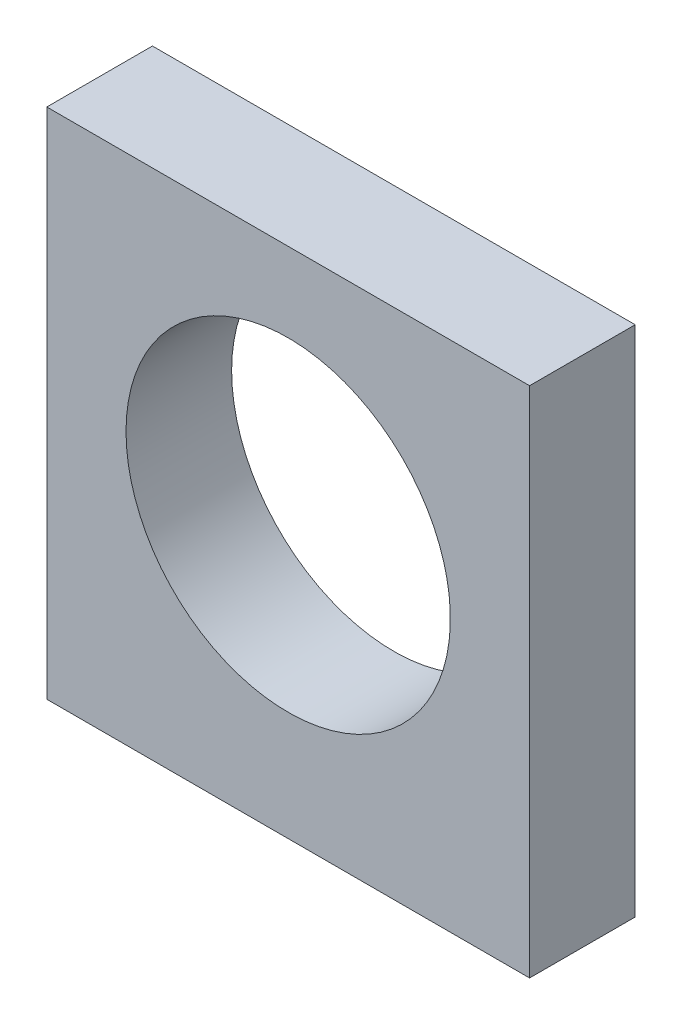
ISO-10303-21;
HEADER;
FILE_DESCRIPTION(('STEP AP214'),'2;1');
FILE_NAME('part.step','',(''),(''),'','','');
FILE_SCHEMA(('AUTOMOTIVE_DESIGN { 1 0 10303 214 1 1 1 1 }'));
ENDSEC;
DATA;
#1=APPLICATION_CONTEXT('core data for automotive mechanical design processes');
#2=APPLICATION_PROTOCOL_DEFINITION('international standard','automotive_design',2000,#1);
#3=PRODUCT_CONTEXT('',#1,'mechanical');
#4=PRODUCT('Part','Part','',(#3));
#5=PRODUCT_RELATED_PRODUCT_CATEGORY('part','',(#4));
#6=PRODUCT_DEFINITION_FORMATION('','',#4);
#7=PRODUCT_DEFINITION_CONTEXT('part definition',#1,'design');
#8=PRODUCT_DEFINITION('design','',#6,#7);
#9=PRODUCT_DEFINITION_SHAPE('','',#8);
#10=(LENGTH_UNIT() NAMED_UNIT(*) SI_UNIT(.MILLI.,.METRE.));
#11=(NAMED_UNIT(*) PLANE_ANGLE_UNIT() SI_UNIT($,.RADIAN.));
#12=(NAMED_UNIT(*) SI_UNIT($,.STERADIAN.) SOLID_ANGLE_UNIT());
#13=UNCERTAINTY_MEASURE_WITH_UNIT(LENGTH_MEASURE(1.E-05),#10,'distance_accuracy_value','');
#14=(GEOMETRIC_REPRESENTATION_CONTEXT(3) GLOBAL_UNCERTAINTY_ASSIGNED_CONTEXT((#13)) GLOBAL_UNIT_ASSIGNED_CONTEXT((#10,
#11,#12)) REPRESENTATION_CONTEXT('',''));
#15=CARTESIAN_POINT('',(0.,0.,0.));
#16=DIRECTION('',(0.,0.,1.));
#17=DIRECTION('',(1.,0.,0.));
#18=AXIS2_PLACEMENT_3D('',#15,#16,#17);
#19=CARTESIAN_POINT('',(-30.2679908457876,-2.71237973809173,8.6839378711212));
#20=DIRECTION('',(0.,1.,0.));
#21=DIRECTION('',(0.,0.,1.));
#22=AXIS2_PLACEMENT_3D('',#19,#20,#21);
#23=PLANE('',#22);
#24=CARTESIAN_POINT('',(-30.2679908457876,-2.71237973809173,8.6839378711212));
#25=DIRECTION('',(0.,1.,0.));
#26=DIRECTION('',(0.,0.,1.));
#27=AXIS2_PLACEMENT_3D('',#24,#25,#26);
#28=CIRCLE('',#27,1.5);
#29=CARTESIAN_POINT('',(-30.2679908457876,-2.71237973809173,10.1839378711212));
#30=VERTEX_POINT('',#29);
#31=EDGE_CURVE('E20',#30,#30,#28,.F.);
#32=ORIENTED_EDGE('',*,*,#31,.T.);
#33=EDGE_LOOP('',(#32));
#34=FACE_BOUND('',#33,.T.);
#35=ADVANCED_FACE('F17',(#34),#23,.F.);
#36=CARTESIAN_POINT('',(-13.2679908457876,-2.71237973809173,8.68393787112121));
#37=DIRECTION('',(0.,1.,0.));
#38=DIRECTION('',(0.,0.,1.));
#39=AXIS2_PLACEMENT_3D('',#36,#37,#38);
#40=PLANE('',#39);
#41=CARTESIAN_POINT('',(-13.2679908457876,-2.71237973809173,8.68393787112121));
#42=DIRECTION('',(0.,1.,0.));
#43=DIRECTION('',(0.,0.,1.));
#44=AXIS2_PLACEMENT_3D('',#41,#42,#43);
#45=CIRCLE('',#44,1.5);
#46=CARTESIAN_POINT('',(-13.2679908457876,-2.71237973809172,10.1839378711212));
#47=VERTEX_POINT('',#46);
#48=EDGE_CURVE('E108',#47,#47,#45,.F.);
#49=ORIENTED_EDGE('',*,*,#48,.T.);
#50=EDGE_LOOP('',(#49));
#51=FACE_BOUND('',#50,.T.);
#52=ADVANCED_FACE('F174',(#51),#40,.F.);
#53=CARTESIAN_POINT('',(-27.7679908457876,-2.71237973809173,10.7839378711212));
#54=DIRECTION('',(0.,1.,0.));
#55=DIRECTION('',(0.,0.,1.));
#56=AXIS2_PLACEMENT_3D('',#53,#54,#55);
#57=PLANE('',#56);
#58=CARTESIAN_POINT('',(-27.7679908457876,-2.71237973809173,10.7839378711212));
#59=DIRECTION('',(0.,1.,0.));
#60=DIRECTION('',(0.,0.,1.));
#61=AXIS2_PLACEMENT_3D('',#58,#59,#60);
#62=CIRCLE('',#61,1.);
#63=CARTESIAN_POINT('',(-27.7679908457876,-2.71237973809173,11.7839378711212));
#64=VERTEX_POINT('',#63);
#65=EDGE_CURVE('E106',#64,#64,#62,.F.);
#66=ORIENTED_EDGE('',*,*,#65,.T.);
#67=EDGE_LOOP('',(#66));
#68=FACE_BOUND('',#67,.T.);
#69=ADVANCED_FACE('F171',(#68),#57,.F.);
#70=CARTESIAN_POINT('',(-15.7679908457876,-2.71237973809172,10.7839378711212));
#71=DIRECTION('',(0.,1.,0.));
#72=DIRECTION('',(0.,0.,1.));
#73=AXIS2_PLACEMENT_3D('',#70,#71,#72);
#74=PLANE('',#73);
#75=CARTESIAN_POINT('',(-15.7679908457876,-2.71237973809173,10.7839378711212));
#76=DIRECTION('',(0.,1.,0.));
#77=DIRECTION('',(0.,0.,1.));
#78=AXIS2_PLACEMENT_3D('',#75,#76,#77);
#79=CIRCLE('',#78,1.);
#80=CARTESIAN_POINT('',(-15.7679908457876,-2.71237973809172,11.7839378711212));
#81=VERTEX_POINT('',#80);
#82=EDGE_CURVE('E103',#81,#81,#79,.F.);
#83=ORIENTED_EDGE('',*,*,#82,.T.);
#84=EDGE_LOOP('',(#83));
#85=FACE_BOUND('',#84,.T.);
#86=ADVANCED_FACE('F120',(#85),#74,.F.);
#87=CARTESIAN_POINT('',(-30.2679908457876,-6.71237973809173,8.68393787112121));
#88=DIRECTION('',(0.,1.,0.));
#89=DIRECTION('',(0.,0.,1.));
#90=AXIS2_PLACEMENT_3D('',#87,#88,#89);
#91=CYLINDRICAL_SURFACE('',#90,1.5);
#92=ORIENTED_EDGE('',*,*,#31,.F.);
#93=EDGE_LOOP('',(#92));
#94=FACE_BOUND('',#93,.T.);
#95=CARTESIAN_POINT('',(-30.2679908457876,-6.71237973809172,8.68393787112121));
#96=DIRECTION('',(0.,1.,0.));
#97=DIRECTION('',(0.,0.,1.));
#98=AXIS2_PLACEMENT_3D('',#95,#96,#97);
#99=CIRCLE('',#98,1.5);
#100=CARTESIAN_POINT('',(-30.2679908457876,-6.71237973809172,10.1839378711212));
#101=VERTEX_POINT('',#100);
#102=EDGE_CURVE('E69',#101,#101,#99,.T.);
#103=ORIENTED_EDGE('',*,*,#102,.F.);
#104=EDGE_LOOP('',(#103));
#105=FACE_BOUND('',#104,.T.);
#106=ADVANCED_FACE('F116',(#94,#105),#91,.F.);
#107=CARTESIAN_POINT('',(-13.2679908457876,-6.71237973809173,8.68393787112121));
#108=DIRECTION('',(0.,1.,0.));
#109=DIRECTION('',(0.,0.,1.));
#110=AXIS2_PLACEMENT_3D('',#107,#108,#109);
#111=CYLINDRICAL_SURFACE('',#110,1.5);
#112=ORIENTED_EDGE('',*,*,#48,.F.);
#113=EDGE_LOOP('',(#112));
#114=FACE_BOUND('',#113,.T.);
#115=CARTESIAN_POINT('',(-13.2679908457876,-6.71237973809172,8.68393787112121));
#116=DIRECTION('',(0.,1.,0.));
#117=DIRECTION('',(0.,0.,1.));
#118=AXIS2_PLACEMENT_3D('',#115,#116,#117);
#119=CIRCLE('',#118,1.5);
#120=CARTESIAN_POINT('',(-13.2679908457876,-6.71237973809172,10.1839378711212));
#121=VERTEX_POINT('',#120);
#122=EDGE_CURVE('E96',#121,#121,#119,.T.);
#123=ORIENTED_EDGE('',*,*,#122,.F.);
#124=EDGE_LOOP('',(#123));
#125=FACE_BOUND('',#124,.T.);
#126=ADVANCED_FACE('F119',(#114,#125),#111,.F.);
#127=CARTESIAN_POINT('',(-27.7679908457876,-6.71237973809173,10.7839378711212));
#128=DIRECTION('',(0.,1.,0.));
#129=DIRECTION('',(0.,0.,1.));
#130=AXIS2_PLACEMENT_3D('',#127,#128,#129);
#131=CYLINDRICAL_SURFACE('',#130,1.);
#132=ORIENTED_EDGE('',*,*,#65,.F.);
#133=EDGE_LOOP('',(#132));
#134=FACE_BOUND('',#133,.T.);
#135=CARTESIAN_POINT('',(-27.7679908457876,-6.71237973809172,10.7839378711212));
#136=DIRECTION('',(0.,1.,0.));
#137=DIRECTION('',(0.,0.,1.));
#138=AXIS2_PLACEMENT_3D('',#135,#136,#137);
#139=CIRCLE('',#138,1.);
#140=CARTESIAN_POINT('',(-27.7679908457876,-6.71237973809172,11.7839378711212));
#141=VERTEX_POINT('',#140);
#142=EDGE_CURVE('E86',#141,#141,#139,.T.);
#143=ORIENTED_EDGE('',*,*,#142,.F.);
#144=EDGE_LOOP('',(#143));
#145=FACE_BOUND('',#144,.T.);
#146=ADVANCED_FACE('F161',(#134,#145),#131,.F.);
#147=CARTESIAN_POINT('',(-15.7679908457876,-6.71237973809172,10.7839378711212));
#148=DIRECTION('',(0.,1.,0.));
#149=DIRECTION('',(0.,0.,1.));
#150=AXIS2_PLACEMENT_3D('',#147,#148,#149);
#151=CYLINDRICAL_SURFACE('',#150,1.);
#152=ORIENTED_EDGE('',*,*,#82,.F.);
#153=EDGE_LOOP('',(#152));
#154=FACE_BOUND('',#153,.T.);
#155=CARTESIAN_POINT('',(-15.7679908457876,-6.71237973809172,10.7839378711212));
#156=DIRECTION('',(0.,1.,0.));
#157=DIRECTION('',(0.,0.,1.));
#158=AXIS2_PLACEMENT_3D('',#155,#156,#157);
#159=CIRCLE('',#158,1.);
#160=CARTESIAN_POINT('',(-15.7679908457876,-6.71237973809172,11.7839378711212));
#161=VERTEX_POINT('',#160);
#162=EDGE_CURVE('E83',#161,#161,#159,.T.);
#163=ORIENTED_EDGE('',*,*,#162,.F.);
#164=EDGE_LOOP('',(#163));
#165=FACE_BOUND('',#164,.T.);
#166=ADVANCED_FACE('F155',(#154,#165),#151,.F.);
#167=CARTESIAN_POINT('',(-21.7679908457876,10.2876202619083,13.2839378711212));
#168=DIRECTION('',(0.,0.,-1.));
#169=DIRECTION('',(-1.,0.,0.));
#170=AXIS2_PLACEMENT_3D('',#167,#168,#169);
#171=PLANE('',#170);
#172=DIRECTION('',(0.,1.,0.));
#173=VECTOR('',#172,1.);
#174=CARTESIAN_POINT('',(-5.76799084578759,-6.71237973809171,13.2839378711212));
#175=LINE('',#174,#173);
#176=CARTESIAN_POINT('',(-5.76799084578761,27.2876202619083,13.2839378711212));
#177=VERTEX_POINT('',#176);
#178=CARTESIAN_POINT('',(-5.76799084578759,-6.71237973809171,13.2839378711212));
#179=VERTEX_POINT('',#178);
#180=EDGE_CURVE('E60',#177,#179,#175,.F.);
#181=ORIENTED_EDGE('',*,*,#180,.F.);
#182=DIRECTION('',(1.,0.,0.));
#183=VECTOR('',#182,1.);
#184=CARTESIAN_POINT('',(-5.76799084578761,27.2876202619083,13.2839378711212));
#185=LINE('',#184,#183);
#186=CARTESIAN_POINT('',(-37.7679908457876,27.2876202619083,13.2839378711212));
#187=VERTEX_POINT('',#186);
#188=EDGE_CURVE('E284',#187,#177,#185,.T.);
#189=ORIENTED_EDGE('',*,*,#188,.F.);
#190=DIRECTION('',(0.,1.,0.));
#191=VECTOR('',#190,1.);
#192=CARTESIAN_POINT('',(-37.7679908457876,27.2876202619083,13.2839378711212));
#193=LINE('',#192,#191);
#194=CARTESIAN_POINT('',(-37.7679908457876,-6.71237973809172,13.2839378711212));
#195=VERTEX_POINT('',#194);
#196=EDGE_CURVE('E74',#195,#187,#193,.T.);
#197=ORIENTED_EDGE('',*,*,#196,.F.);
#198=DIRECTION('',(1.,0.,0.));
#199=VECTOR('',#198,1.);
#200=CARTESIAN_POINT('',(-37.7679908457876,-6.71237973809172,13.2839378711212));
#201=LINE('',#200,#199);
#202=EDGE_CURVE('E55',#179,#195,#201,.F.);
#203=ORIENTED_EDGE('',*,*,#202,.F.);
#204=EDGE_LOOP('',(#181,#189,#197,#203));
#205=FACE_BOUND('',#204,.T.);
#206=CARTESIAN_POINT('',(-21.7679908457876,11.2876202619083,13.2839378711212));
#207=DIRECTION('',(0.,0.,-1.));
#208=DIRECTION('',(-1.,0.,0.));
#209=AXIS2_PLACEMENT_3D('',#206,#207,#208);
#210=CIRCLE('',#209,10.75);
#211=CARTESIAN_POINT('',(-32.5179908457876,11.2876202619083,13.2839378711212));
#212=VERTEX_POINT('',#211);
#213=EDGE_CURVE('E70',#212,#212,#210,.T.);
#214=ORIENTED_EDGE('',*,*,#213,.T.);
#215=EDGE_LOOP('',(#214));
#216=FACE_BOUND('',#215,.T.);
#217=ADVANCED_FACE('F72',(#205,#216),#171,.F.);
#218=CARTESIAN_POINT('',(-21.7679908457876,11.2876202619083,13.2839378711212));
#219=DIRECTION('',(0.,0.,-1.));
#220=DIRECTION('',(-1.,0.,0.));
#221=AXIS2_PLACEMENT_3D('',#218,#219,#220);
#222=CYLINDRICAL_SURFACE('',#221,10.75);
#223=ORIENTED_EDGE('',*,*,#213,.F.);
#224=EDGE_LOOP('',(#223));
#225=FACE_BOUND('',#224,.T.);
#226=CARTESIAN_POINT('',(-21.7679908457876,11.2876202619083,6.28393787112119));
#227=DIRECTION('',(0.,0.,-1.));
#228=DIRECTION('',(-1.,0.,0.));
#229=AXIS2_PLACEMENT_3D('',#226,#227,#228);
#230=CIRCLE('',#229,10.75);
#231=CARTESIAN_POINT('',(-32.5179908457876,11.2876202619083,6.28393787112118));
#232=VERTEX_POINT('',#231);
#233=EDGE_CURVE('E90',#232,#232,#230,.F.);
#234=ORIENTED_EDGE('',*,*,#233,.F.);
#235=EDGE_LOOP('',(#234));
#236=FACE_BOUND('',#235,.T.);
#237=ADVANCED_FACE('F134',(#225,#236),#222,.F.);
#238=CARTESIAN_POINT('',(-5.76799084578759,-6.71237973809171,13.2839378711212));
#239=DIRECTION('',(1.,0.,0.));
#240=DIRECTION('',(0.,1.,0.));
#241=AXIS2_PLACEMENT_3D('',#238,#239,#240);
#242=PLANE('',#241);
#243=ORIENTED_EDGE('',*,*,#180,.T.);
#244=DIRECTION('',(0.,0.,1.));
#245=VECTOR('',#244,1.);
#246=CARTESIAN_POINT('',(-5.76799084578757,-6.7123797380917,13.2839378711212));
#247=LINE('',#246,#245);
#248=CARTESIAN_POINT('',(-5.76799084578759,-6.71237973809171,6.28393787112122));
#249=VERTEX_POINT('',#248);
#250=EDGE_CURVE('E62',#249,#179,#247,.T.);
#251=ORIENTED_EDGE('',*,*,#250,.F.);
#252=DIRECTION('',(0.,1.,0.));
#253=VECTOR('',#252,1.);
#254=CARTESIAN_POINT('',(-5.7679908457876,10.2876202619083,6.28393787112123));
#255=LINE('',#254,#253);
#256=CARTESIAN_POINT('',(-5.76799084578761,27.2876202619083,6.28393787112123));
#257=VERTEX_POINT('',#256);
#258=EDGE_CURVE('E92',#257,#249,#255,.F.);
#259=ORIENTED_EDGE('',*,*,#258,.F.);
#260=DIRECTION('',(0.,0.,1.));
#261=VECTOR('',#260,1.);
#262=CARTESIAN_POINT('',(-5.76799084578761,27.2876202619083,13.2839378711212));
#263=LINE('',#262,#261);
#264=EDGE_CURVE('E65',#177,#257,#263,.F.);
#265=ORIENTED_EDGE('',*,*,#264,.F.);
#266=EDGE_LOOP('',(#243,#251,#259,#265));
#267=FACE_BOUND('',#266,.T.);
#268=ADVANCED_FACE('F61',(#267),#242,.T.);
#269=CARTESIAN_POINT('',(-37.7679908457876,-6.71237973809172,13.2839378711212));
#270=DIRECTION('',(0.,-1.,0.));
#271=DIRECTION('',(1.,0.,0.));
#272=AXIS2_PLACEMENT_3D('',#269,#270,#271);
#273=PLANE('',#272);
#274=ORIENTED_EDGE('',*,*,#202,.T.);
#275=DIRECTION('',(0.,0.,1.));
#276=VECTOR('',#275,1.);
#277=CARTESIAN_POINT('',(-37.7679908457876,-6.71237973809173,13.2839378711212));
#278=LINE('',#277,#276);
#279=CARTESIAN_POINT('',(-37.7679908457876,-6.71237973809172,6.28393787112117));
#280=VERTEX_POINT('',#279);
#281=EDGE_CURVE('E76',#280,#195,#278,.T.);
#282=ORIENTED_EDGE('',*,*,#281,.F.);
#283=DIRECTION('',(-1.,0.,0.));
#284=VECTOR('',#283,1.);
#285=CARTESIAN_POINT('',(-21.7679908457876,-6.71237973809171,6.2839378711212));
#286=LINE('',#285,#284);
#287=EDGE_CURVE('E81',#249,#280,#286,.T.);
#288=ORIENTED_EDGE('',*,*,#287,.F.);
#289=ORIENTED_EDGE('',*,*,#250,.T.);
#290=EDGE_LOOP('',(#274,#282,#288,#289));
#291=FACE_BOUND('',#290,.T.);
#292=ORIENTED_EDGE('',*,*,#162,.T.);
#293=EDGE_LOOP('',(#292));
#294=FACE_BOUND('',#293,.T.);
#295=ORIENTED_EDGE('',*,*,#142,.T.);
#296=EDGE_LOOP('',(#295));
#297=FACE_BOUND('',#296,.T.);
#298=ORIENTED_EDGE('',*,*,#122,.T.);
#299=EDGE_LOOP('',(#298));
#300=FACE_BOUND('',#299,.T.);
#301=ORIENTED_EDGE('',*,*,#102,.T.);
#302=EDGE_LOOP('',(#301));
#303=FACE_BOUND('',#302,.T.);
#304=ADVANCED_FACE('F78',(#291,#294,#297,#300,#303),#273,.T.);
#305=CARTESIAN_POINT('',(-37.7679908457876,27.2876202619083,13.2839378711212));
#306=DIRECTION('',(-1.,0.,0.));
#307=DIRECTION('',(0.,0.,1.));
#308=AXIS2_PLACEMENT_3D('',#305,#306,#307);
#309=PLANE('',#308);
#310=ORIENTED_EDGE('',*,*,#196,.T.);
#311=DIRECTION('',(0.,0.,1.));
#312=VECTOR('',#311,1.);
#313=CARTESIAN_POINT('',(-37.7679908457876,27.2876202619083,13.2839378711212));
#314=LINE('',#313,#312);
#315=CARTESIAN_POINT('',(-37.7679908457876,27.2876202619083,6.28393787112118));
#316=VERTEX_POINT('',#315);
#317=EDGE_CURVE('E35',#316,#187,#314,.T.);
#318=ORIENTED_EDGE('',*,*,#317,.F.);
#319=DIRECTION('',(0.,1.,0.));
#320=VECTOR('',#319,1.);
#321=CARTESIAN_POINT('',(-37.7679908457876,10.2876202619083,6.28393787112117));
#322=LINE('',#321,#320);
#323=EDGE_CURVE('E26',#280,#316,#322,.T.);
#324=ORIENTED_EDGE('',*,*,#323,.F.);
#325=ORIENTED_EDGE('',*,*,#281,.T.);
#326=EDGE_LOOP('',(#310,#318,#324,#325));
#327=FACE_BOUND('',#326,.T.);
#328=ADVANCED_FACE('F125',(#327),#309,.T.);
#329=CARTESIAN_POINT('',(-5.76799084578761,27.2876202619083,13.2839378711212));
#330=DIRECTION('',(0.,1.,0.));
#331=DIRECTION('',(0.,0.,1.));
#332=AXIS2_PLACEMENT_3D('',#329,#330,#331);
#333=PLANE('',#332);
#334=ORIENTED_EDGE('',*,*,#188,.T.);
#335=ORIENTED_EDGE('',*,*,#264,.T.);
#336=DIRECTION('',(-1.,0.,0.));
#337=VECTOR('',#336,1.);
#338=CARTESIAN_POINT('',(-21.7679908457876,27.2876202619083,6.28393787112119));
#339=LINE('',#338,#337);
#340=EDGE_CURVE('E11',#316,#257,#339,.F.);
#341=ORIENTED_EDGE('',*,*,#340,.F.);
#342=ORIENTED_EDGE('',*,*,#317,.T.);
#343=EDGE_LOOP('',(#334,#335,#341,#342));
#344=FACE_BOUND('',#343,.T.);
#345=ADVANCED_FACE('F132',(#344),#333,.T.);
#346=CARTESIAN_POINT('',(-21.7679908457876,10.2876202619083,6.2839378711212));
#347=DIRECTION('',(0.,0.,-1.));
#348=DIRECTION('',(-1.,0.,0.));
#349=AXIS2_PLACEMENT_3D('',#346,#347,#348);
#350=PLANE('',#349);
#351=ORIENTED_EDGE('',*,*,#323,.T.);
#352=ORIENTED_EDGE('',*,*,#340,.T.);
#353=ORIENTED_EDGE('',*,*,#258,.T.);
#354=ORIENTED_EDGE('',*,*,#287,.T.);
#355=EDGE_LOOP('',(#351,#352,#353,#354));
#356=FACE_BOUND('',#355,.T.);
#357=ORIENTED_EDGE('',*,*,#233,.T.);
#358=EDGE_LOOP('',(#357));
#359=FACE_BOUND('',#358,.T.);
#360=ADVANCED_FACE('F136',(#356,#359),#350,.T.);
#361=CLOSED_SHELL('',(#35,#52,#69,#86,#106,#126,#146,#166,#217,#237,#268,#304,#328,#345,#360));
#362=MANIFOLD_SOLID_BREP('B1',#361);
#363=ADVANCED_BREP_SHAPE_REPRESENTATION('',(#18,#362),#14);
#364=SHAPE_DEFINITION_REPRESENTATION(#9,#363);
ENDSEC;
END-ISO-10303-21;
